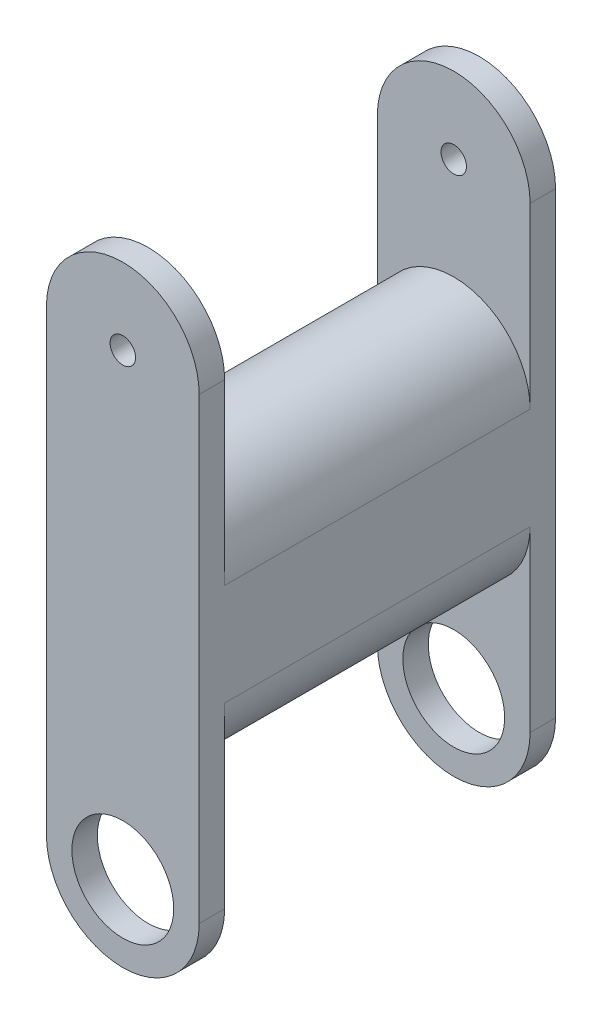
ISO-10303-21;
HEADER;
FILE_DESCRIPTION(('STEP AP214'),'2;1');
FILE_NAME('part.step','',(''),(''),'','','');
FILE_SCHEMA(('AUTOMOTIVE_DESIGN { 1 0 10303 214 1 1 1 1 }'));
ENDSEC;
DATA;
#1=APPLICATION_CONTEXT('core data for automotive mechanical design processes');
#2=APPLICATION_PROTOCOL_DEFINITION('international standard','automotive_design',2000,#1);
#3=PRODUCT_CONTEXT('',#1,'mechanical');
#4=PRODUCT('Part','Part','',(#3));
#5=PRODUCT_RELATED_PRODUCT_CATEGORY('part','',(#4));
#6=PRODUCT_DEFINITION_FORMATION('','',#4);
#7=PRODUCT_DEFINITION_CONTEXT('part definition',#1,'design');
#8=PRODUCT_DEFINITION('design','',#6,#7);
#9=PRODUCT_DEFINITION_SHAPE('','',#8);
#10=(LENGTH_UNIT() NAMED_UNIT(*) SI_UNIT(.MILLI.,.METRE.));
#11=(NAMED_UNIT(*) PLANE_ANGLE_UNIT() SI_UNIT($,.RADIAN.));
#12=(NAMED_UNIT(*) SI_UNIT($,.STERADIAN.) SOLID_ANGLE_UNIT());
#13=UNCERTAINTY_MEASURE_WITH_UNIT(LENGTH_MEASURE(1.E-05),#10,'distance_accuracy_value','');
#14=(GEOMETRIC_REPRESENTATION_CONTEXT(3) GLOBAL_UNCERTAINTY_ASSIGNED_CONTEXT((#13)) GLOBAL_UNIT_ASSIGNED_CONTEXT((#10,
#11,#12)) REPRESENTATION_CONTEXT('',''));
#15=CARTESIAN_POINT('',(0.,0.,0.));
#16=DIRECTION('',(0.,0.,1.));
#17=DIRECTION('',(1.,0.,0.));
#18=AXIS2_PLACEMENT_3D('',#15,#16,#17);
#19=CARTESIAN_POINT('',(15.,90.,70.));
#20=DIRECTION('',(-1.,0.,0.));
#21=DIRECTION('',(0.,-1.,0.));
#22=AXIS2_PLACEMENT_3D('',#19,#20,#21);
#23=PLANE('',#22);
#24=DIRECTION('',(0.,0.,1.));
#25=VECTOR('',#24,1.);
#26=CARTESIAN_POINT('',(15.,55.,-16.2132034355964));
#27=LINE('',#26,#25);
#28=CARTESIAN_POINT('',(15.,55.,5.00000000000001));
#29=VERTEX_POINT('',#28);
#30=CARTESIAN_POINT('',(15.,55.,65.));
#31=VERTEX_POINT('',#30);
#32=EDGE_CURVE('E190',#29,#31,#27,.T.);
#33=ORIENTED_EDGE('',*,*,#32,.T.);
#34=DIRECTION('',(0.,-1.,0.));
#35=VECTOR('',#34,1.);
#36=CARTESIAN_POINT('',(15.,90.,65.));
#37=LINE('',#36,#35);
#38=CARTESIAN_POINT('',(15.,90.,65.));
#39=VERTEX_POINT('',#38);
#40=EDGE_CURVE('E175',#39,#31,#37,.T.);
#41=ORIENTED_EDGE('',*,*,#40,.F.);
#42=DIRECTION('',(0.,0.,-1.));
#43=VECTOR('',#42,1.);
#44=CARTESIAN_POINT('',(15.,90.,70.));
#45=LINE('',#44,#43);
#46=CARTESIAN_POINT('',(15.,90.,70.));
#47=VERTEX_POINT('',#46);
#48=EDGE_CURVE('E264',#47,#39,#45,.T.);
#49=ORIENTED_EDGE('',*,*,#48,.F.);
#50=DIRECTION('',(0.,1.,0.));
#51=VECTOR('',#50,1.);
#52=CARTESIAN_POINT('',(15.,90.,70.));
#53=LINE('',#52,#51);
#54=CARTESIAN_POINT('',(15.,0.,70.));
#55=VERTEX_POINT('',#54);
#56=EDGE_CURVE('E92',#55,#47,#53,.T.);
#57=ORIENTED_EDGE('',*,*,#56,.F.);
#58=DIRECTION('',(0.,0.,-1.));
#59=VECTOR('',#58,1.);
#60=CARTESIAN_POINT('',(15.,0.,70.));
#61=LINE('',#60,#59);
#62=CARTESIAN_POINT('',(15.,0.,65.));
#63=VERTEX_POINT('',#62);
#64=EDGE_CURVE('E266',#55,#63,#61,.T.);
#65=ORIENTED_EDGE('',*,*,#64,.T.);
#66=DIRECTION('',(0.,-1.,0.));
#67=VECTOR('',#66,1.);
#68=CARTESIAN_POINT('',(15.,90.,65.));
#69=LINE('',#68,#67);
#70=CARTESIAN_POINT('',(15.,35.,65.));
#71=VERTEX_POINT('',#70);
#72=EDGE_CURVE('E228',#71,#63,#69,.T.);
#73=ORIENTED_EDGE('',*,*,#72,.F.);
#74=DIRECTION('',(0.,0.,1.));
#75=VECTOR('',#74,1.);
#76=CARTESIAN_POINT('',(15.,35.,-16.2132034355964));
#77=LINE('',#76,#75);
#78=CARTESIAN_POINT('',(15.,35.,5.00000000000001));
#79=VERTEX_POINT('',#78);
#80=EDGE_CURVE('E198',#79,#71,#77,.T.);
#81=ORIENTED_EDGE('',*,*,#80,.F.);
#82=DIRECTION('',(0.,-1.,0.));
#83=VECTOR('',#82,1.);
#84=CARTESIAN_POINT('',(15.,90.,5.00000000000005));
#85=LINE('',#84,#83);
#86=CARTESIAN_POINT('',(15.,0.,5.00000000000003));
#87=VERTEX_POINT('',#86);
#88=EDGE_CURVE('E232',#79,#87,#85,.T.);
#89=ORIENTED_EDGE('',*,*,#88,.T.);
#90=CARTESIAN_POINT('',(15.,0.,0.));
#91=VERTEX_POINT('',#90);
#92=EDGE_CURVE('E110',#87,#91,#61,.T.);
#93=ORIENTED_EDGE('',*,*,#92,.T.);
#94=DIRECTION('',(0.,1.,0.));
#95=VECTOR('',#94,1.);
#96=CARTESIAN_POINT('',(15.,90.,0.));
#97=LINE('',#96,#95);
#98=CARTESIAN_POINT('',(15.,90.,0.));
#99=VERTEX_POINT('',#98);
#100=EDGE_CURVE('E252',#91,#99,#97,.T.);
#101=ORIENTED_EDGE('',*,*,#100,.T.);
#102=CARTESIAN_POINT('',(15.,90.,5.));
#103=VERTEX_POINT('',#102);
#104=EDGE_CURVE('E118',#103,#99,#45,.T.);
#105=ORIENTED_EDGE('',*,*,#104,.F.);
#106=DIRECTION('',(0.,-1.,0.));
#107=VECTOR('',#106,1.);
#108=CARTESIAN_POINT('',(15.,90.,5.));
#109=LINE('',#108,#107);
#110=EDGE_CURVE('E195',#103,#29,#109,.T.);
#111=ORIENTED_EDGE('',*,*,#110,.T.);
#112=EDGE_LOOP('',(#33,#41,#49,#57,#65,#73,#81,#89,#93,#101,#105,#111));
#113=FACE_BOUND('',#112,.T.);
#114=ADVANCED_FACE('F73',(#113),#23,.F.);
#115=CARTESIAN_POINT('',(0.,90.,70.));
#116=DIRECTION('',(0.,0.,-1.));
#117=DIRECTION('',(-1.,0.,0.));
#118=AXIS2_PLACEMENT_3D('',#115,#116,#117);
#119=CYLINDRICAL_SURFACE('',#118,15.);
#120=CARTESIAN_POINT('',(0.,90.,65.));
#121=DIRECTION('',(0.,0.,-1.));
#122=DIRECTION('',(-1.,0.,0.));
#123=AXIS2_PLACEMENT_3D('',#120,#121,#122);
#124=CIRCLE('',#123,15.);
#125=CARTESIAN_POINT('',(-15.,90.,65.));
#126=VERTEX_POINT('',#125);
#127=EDGE_CURVE('E180',#126,#39,#124,.T.);
#128=ORIENTED_EDGE('',*,*,#127,.F.);
#129=DIRECTION('',(0.,0.,-1.));
#130=VECTOR('',#129,1.);
#131=CARTESIAN_POINT('',(-15.,90.,70.));
#132=LINE('',#131,#130);
#133=CARTESIAN_POINT('',(-15.,90.,70.));
#134=VERTEX_POINT('',#133);
#135=EDGE_CURVE('E12',#134,#126,#132,.T.);
#136=ORIENTED_EDGE('',*,*,#135,.F.);
#137=CARTESIAN_POINT('',(0.,90.,70.));
#138=DIRECTION('',(0.,0.,1.));
#139=DIRECTION('',(1.,0.,0.));
#140=AXIS2_PLACEMENT_3D('',#137,#138,#139);
#141=CIRCLE('',#140,15.);
#142=EDGE_CURVE('E250',#47,#134,#141,.T.);
#143=ORIENTED_EDGE('',*,*,#142,.F.);
#144=ORIENTED_EDGE('',*,*,#48,.T.);
#145=EDGE_LOOP('',(#128,#136,#143,#144));
#146=FACE_BOUND('',#145,.T.);
#147=ADVANCED_FACE('F300',(#146),#119,.T.);
#148=CARTESIAN_POINT('',(-15.,90.,70.));
#149=DIRECTION('',(1.,0.,0.));
#150=DIRECTION('',(0.,1.,0.));
#151=AXIS2_PLACEMENT_3D('',#148,#149,#150);
#152=PLANE('',#151);
#153=DIRECTION('',(0.,0.,1.));
#154=VECTOR('',#153,1.);
#155=CARTESIAN_POINT('',(-15.,55.,-16.2132034355964));
#156=LINE('',#155,#154);
#157=CARTESIAN_POINT('',(-15.,55.,5.00000000000001));
#158=VERTEX_POINT('',#157);
#159=CARTESIAN_POINT('',(-15.,55.,65.));
#160=VERTEX_POINT('',#159);
#161=EDGE_CURVE('E192',#158,#160,#156,.T.);
#162=ORIENTED_EDGE('',*,*,#161,.F.);
#163=DIRECTION('',(0.,-1.,0.));
#164=VECTOR('',#163,1.);
#165=CARTESIAN_POINT('',(-15.,120.,5.));
#166=LINE('',#165,#164);
#167=CARTESIAN_POINT('',(-15.,90.,5.00000000000001));
#168=VERTEX_POINT('',#167);
#169=EDGE_CURVE('E216',#168,#158,#166,.T.);
#170=ORIENTED_EDGE('',*,*,#169,.F.);
#171=CARTESIAN_POINT('',(-15.,90.,0.));
#172=VERTEX_POINT('',#171);
#173=EDGE_CURVE('E83',#168,#172,#132,.T.);
#174=ORIENTED_EDGE('',*,*,#173,.T.);
#175=DIRECTION('',(0.,-1.,0.));
#176=VECTOR('',#175,1.);
#177=CARTESIAN_POINT('',(-15.,90.,0.));
#178=LINE('',#177,#176);
#179=CARTESIAN_POINT('',(-15.,0.,0.));
#180=VERTEX_POINT('',#179);
#181=EDGE_CURVE('E258',#172,#180,#178,.T.);
#182=ORIENTED_EDGE('',*,*,#181,.T.);
#183=DIRECTION('',(0.,0.,-1.));
#184=VECTOR('',#183,1.);
#185=CARTESIAN_POINT('',(-15.,0.,70.));
#186=LINE('',#185,#184);
#187=CARTESIAN_POINT('',(-15.,0.,5.00000000000002));
#188=VERTEX_POINT('',#187);
#189=EDGE_CURVE('E269',#188,#180,#186,.T.);
#190=ORIENTED_EDGE('',*,*,#189,.F.);
#191=DIRECTION('',(0.,-1.,0.));
#192=VECTOR('',#191,1.);
#193=CARTESIAN_POINT('',(-15.,20.,5.00000000000003));
#194=LINE('',#193,#192);
#195=CARTESIAN_POINT('',(-15.,35.,5.00000000000001));
#196=VERTEX_POINT('',#195);
#197=EDGE_CURVE('E217',#196,#188,#194,.T.);
#198=ORIENTED_EDGE('',*,*,#197,.F.);
#199=DIRECTION('',(0.,0.,1.));
#200=VECTOR('',#199,1.);
#201=CARTESIAN_POINT('',(-15.,35.,-16.2132034355964));
#202=LINE('',#201,#200);
#203=CARTESIAN_POINT('',(-15.,35.,65.));
#204=VERTEX_POINT('',#203);
#205=EDGE_CURVE('E193',#196,#204,#202,.T.);
#206=ORIENTED_EDGE('',*,*,#205,.T.);
#207=DIRECTION('',(0.,-1.,0.));
#208=VECTOR('',#207,1.);
#209=CARTESIAN_POINT('',(-15.,20.,65.));
#210=LINE('',#209,#208);
#211=CARTESIAN_POINT('',(-15.,0.,65.));
#212=VERTEX_POINT('',#211);
#213=EDGE_CURVE('E208',#204,#212,#210,.T.);
#214=ORIENTED_EDGE('',*,*,#213,.T.);
#215=CARTESIAN_POINT('',(-15.,0.,70.));
#216=VERTEX_POINT('',#215);
#217=EDGE_CURVE('E270',#216,#212,#186,.T.);
#218=ORIENTED_EDGE('',*,*,#217,.F.);
#219=DIRECTION('',(0.,-1.,0.));
#220=VECTOR('',#219,1.);
#221=CARTESIAN_POINT('',(-15.,90.,70.));
#222=LINE('',#221,#220);
#223=EDGE_CURVE('E124',#134,#216,#222,.T.);
#224=ORIENTED_EDGE('',*,*,#223,.F.);
#225=ORIENTED_EDGE('',*,*,#135,.T.);
#226=DIRECTION('',(0.,-1.,0.));
#227=VECTOR('',#226,1.);
#228=CARTESIAN_POINT('',(-15.,120.,65.));
#229=LINE('',#228,#227);
#230=EDGE_CURVE('E214',#126,#160,#229,.T.);
#231=ORIENTED_EDGE('',*,*,#230,.T.);
#232=EDGE_LOOP('',(#162,#170,#174,#182,#190,#198,#206,#214,#218,#224,#225,#231));
#233=FACE_BOUND('',#232,.T.);
#234=ADVANCED_FACE('F291',(#233),#152,.F.);
#235=CARTESIAN_POINT('',(0.,0.,70.));
#236=DIRECTION('',(0.,0.,-1.));
#237=DIRECTION('',(-1.,0.,0.));
#238=AXIS2_PLACEMENT_3D('',#235,#236,#237);
#239=CYLINDRICAL_SURFACE('',#238,15.);
#240=CARTESIAN_POINT('',(0.,0.,65.));
#241=DIRECTION('',(0.,0.,-1.));
#242=DIRECTION('',(-1.,0.,0.));
#243=AXIS2_PLACEMENT_3D('',#240,#241,#242);
#244=CIRCLE('',#243,15.);
#245=EDGE_CURVE('E230',#63,#212,#244,.T.);
#246=ORIENTED_EDGE('',*,*,#245,.F.);
#247=ORIENTED_EDGE('',*,*,#64,.F.);
#248=CARTESIAN_POINT('',(0.,0.,70.));
#249=DIRECTION('',(0.,0.,1.));
#250=DIRECTION('',(1.,0.,0.));
#251=AXIS2_PLACEMENT_3D('',#248,#249,#250);
#252=CIRCLE('',#251,15.);
#253=EDGE_CURVE('E254',#216,#55,#252,.T.);
#254=ORIENTED_EDGE('',*,*,#253,.F.);
#255=ORIENTED_EDGE('',*,*,#217,.T.);
#256=EDGE_LOOP('',(#246,#247,#254,#255));
#257=FACE_BOUND('',#256,.T.);
#258=ADVANCED_FACE('F294',(#257),#239,.T.);
#259=CARTESIAN_POINT('',(0.,0.,70.));
#260=DIRECTION('',(0.,0.,-1.));
#261=DIRECTION('',(-1.,0.,0.));
#262=AXIS2_PLACEMENT_3D('',#259,#260,#261);
#263=CYLINDRICAL_SURFACE('',#262,10.);
#264=CARTESIAN_POINT('',(0.,0.,70.));
#265=DIRECTION('',(0.,0.,1.));
#266=DIRECTION('',(1.,0.,0.));
#267=AXIS2_PLACEMENT_3D('',#264,#265,#266);
#268=CIRCLE('',#267,10.);
#269=CARTESIAN_POINT('',(10.,0.,70.));
#270=VERTEX_POINT('',#269);
#271=EDGE_CURVE('E244',#270,#270,#268,.T.);
#272=ORIENTED_EDGE('',*,*,#271,.T.);
#273=EDGE_LOOP('',(#272));
#274=FACE_BOUND('',#273,.T.);
#275=CARTESIAN_POINT('',(0.,0.,65.));
#276=DIRECTION('',(0.,0.,-1.));
#277=DIRECTION('',(-1.,0.,0.));
#278=AXIS2_PLACEMENT_3D('',#275,#276,#277);
#279=CIRCLE('',#278,10.);
#280=CARTESIAN_POINT('',(-10.,0.,65.));
#281=VERTEX_POINT('',#280);
#282=EDGE_CURVE('E227',#281,#281,#279,.T.);
#283=ORIENTED_EDGE('',*,*,#282,.T.);
#284=EDGE_LOOP('',(#283));
#285=FACE_BOUND('',#284,.T.);
#286=ADVANCED_FACE('F279',(#274,#285),#263,.F.);
#287=CARTESIAN_POINT('',(0.,90.,70.));
#288=DIRECTION('',(0.,0.,-1.));
#289=DIRECTION('',(-1.,0.,0.));
#290=AXIS2_PLACEMENT_3D('',#287,#288,#289);
#291=CYLINDRICAL_SURFACE('',#290,2.5);
#292=CARTESIAN_POINT('',(0.,90.,70.));
#293=DIRECTION('',(0.,0.,1.));
#294=DIRECTION('',(1.,0.,0.));
#295=AXIS2_PLACEMENT_3D('',#292,#293,#294);
#296=CIRCLE('',#295,2.5);
#297=CARTESIAN_POINT('',(2.5,90.,70.));
#298=VERTEX_POINT('',#297);
#299=EDGE_CURVE('E238',#298,#298,#296,.T.);
#300=ORIENTED_EDGE('',*,*,#299,.T.);
#301=EDGE_LOOP('',(#300));
#302=FACE_BOUND('',#301,.T.);
#303=CARTESIAN_POINT('',(0.,90.,65.));
#304=DIRECTION('',(0.,0.,-1.));
#305=DIRECTION('',(-1.,0.,0.));
#306=AXIS2_PLACEMENT_3D('',#303,#304,#305);
#307=CIRCLE('',#306,2.5);
#308=CARTESIAN_POINT('',(-2.5,90.,65.));
#309=VERTEX_POINT('',#308);
#310=EDGE_CURVE('E183',#309,#309,#307,.T.);
#311=ORIENTED_EDGE('',*,*,#310,.T.);
#312=EDGE_LOOP('',(#311));
#313=FACE_BOUND('',#312,.T.);
#314=ADVANCED_FACE('F342',(#302,#313),#291,.F.);
#315=CARTESIAN_POINT('',(0.,90.,70.));
#316=DIRECTION('',(0.,0.,1.));
#317=DIRECTION('',(1.,0.,0.));
#318=AXIS2_PLACEMENT_3D('',#315,#316,#317);
#319=PLANE('',#318);
#320=ORIENTED_EDGE('',*,*,#271,.F.);
#321=EDGE_LOOP('',(#320));
#322=FACE_BOUND('',#321,.T.);
#323=ORIENTED_EDGE('',*,*,#142,.T.);
#324=ORIENTED_EDGE('',*,*,#223,.T.);
#325=ORIENTED_EDGE('',*,*,#253,.T.);
#326=ORIENTED_EDGE('',*,*,#56,.T.);
#327=EDGE_LOOP('',(#323,#324,#325,#326));
#328=FACE_BOUND('',#327,.T.);
#329=ORIENTED_EDGE('',*,*,#299,.F.);
#330=EDGE_LOOP('',(#329));
#331=FACE_BOUND('',#330,.T.);
#332=ADVANCED_FACE('F295',(#322,#328,#331),#319,.T.);
#333=CARTESIAN_POINT('',(0.,90.,0.));
#334=DIRECTION('',(0.,0.,1.));
#335=DIRECTION('',(1.,0.,0.));
#336=AXIS2_PLACEMENT_3D('',#333,#334,#335);
#337=PLANE('',#336);
#338=CARTESIAN_POINT('',(0.,90.,0.));
#339=DIRECTION('',(0.,0.,1.));
#340=DIRECTION('',(1.,0.,0.));
#341=AXIS2_PLACEMENT_3D('',#338,#339,#340);
#342=CIRCLE('',#341,15.);
#343=EDGE_CURVE('E247',#99,#172,#342,.T.);
#344=ORIENTED_EDGE('',*,*,#343,.F.);
#345=ORIENTED_EDGE('',*,*,#100,.F.);
#346=CARTESIAN_POINT('',(0.,0.,0.));
#347=DIRECTION('',(0.,0.,1.));
#348=DIRECTION('',(1.,0.,0.));
#349=AXIS2_PLACEMENT_3D('',#346,#347,#348);
#350=CIRCLE('',#349,15.);
#351=EDGE_CURVE('E261',#180,#91,#350,.T.);
#352=ORIENTED_EDGE('',*,*,#351,.F.);
#353=ORIENTED_EDGE('',*,*,#181,.F.);
#354=EDGE_LOOP('',(#344,#345,#352,#353));
#355=FACE_BOUND('',#354,.T.);
#356=CARTESIAN_POINT('',(0.,0.,0.));
#357=DIRECTION('',(0.,0.,1.));
#358=DIRECTION('',(1.,0.,0.));
#359=AXIS2_PLACEMENT_3D('',#356,#357,#358);
#360=CIRCLE('',#359,10.);
#361=CARTESIAN_POINT('',(10.,0.,0.));
#362=VERTEX_POINT('',#361);
#363=EDGE_CURVE('E241',#362,#362,#360,.T.);
#364=ORIENTED_EDGE('',*,*,#363,.T.);
#365=EDGE_LOOP('',(#364));
#366=FACE_BOUND('',#365,.T.);
#367=CARTESIAN_POINT('',(0.,90.,0.));
#368=DIRECTION('',(0.,0.,1.));
#369=DIRECTION('',(1.,0.,0.));
#370=AXIS2_PLACEMENT_3D('',#367,#368,#369);
#371=CIRCLE('',#370,2.5);
#372=CARTESIAN_POINT('',(2.5,90.,0.));
#373=VERTEX_POINT('',#372);
#374=EDGE_CURVE('E237',#373,#373,#371,.T.);
#375=ORIENTED_EDGE('',*,*,#374,.T.);
#376=EDGE_LOOP('',(#375));
#377=FACE_BOUND('',#376,.T.);
#378=ADVANCED_FACE('F308',(#355,#366,#377),#337,.F.);
#379=ORIENTED_EDGE('',*,*,#173,.F.);
#380=CARTESIAN_POINT('',(0.,90.,5.));
#381=DIRECTION('',(0.,0.,-1.));
#382=DIRECTION('',(0.,1.,0.));
#383=AXIS2_PLACEMENT_3D('',#380,#381,#382);
#384=CIRCLE('',#383,15.);
#385=EDGE_CURVE('E224',#168,#103,#384,.T.);
#386=ORIENTED_EDGE('',*,*,#385,.T.);
#387=ORIENTED_EDGE('',*,*,#104,.T.);
#388=ORIENTED_EDGE('',*,*,#343,.T.);
#389=EDGE_LOOP('',(#379,#386,#387,#388));
#390=FACE_BOUND('',#389,.T.);
#391=ADVANCED_FACE('F75',(#390),#119,.T.);
#392=ORIENTED_EDGE('',*,*,#92,.F.);
#393=CARTESIAN_POINT('',(0.,0.,5.00000000000003));
#394=DIRECTION('',(0.,0.,-1.));
#395=DIRECTION('',(0.,1.,0.));
#396=AXIS2_PLACEMENT_3D('',#393,#394,#395);
#397=CIRCLE('',#396,15.);
#398=EDGE_CURVE('E234',#87,#188,#397,.T.);
#399=ORIENTED_EDGE('',*,*,#398,.T.);
#400=ORIENTED_EDGE('',*,*,#189,.T.);
#401=ORIENTED_EDGE('',*,*,#351,.T.);
#402=EDGE_LOOP('',(#392,#399,#400,#401));
#403=FACE_BOUND('',#402,.T.);
#404=ADVANCED_FACE('F313',(#403),#239,.T.);
#405=CARTESIAN_POINT('',(0.,0.,5.00000000000003));
#406=DIRECTION('',(0.,0.,-1.));
#407=DIRECTION('',(0.,1.,0.));
#408=AXIS2_PLACEMENT_3D('',#405,#406,#407);
#409=CIRCLE('',#408,10.);
#410=CARTESIAN_POINT('',(0.,10.,5.00000000000003));
#411=VERTEX_POINT('',#410);
#412=EDGE_CURVE('E77',#411,#411,#409,.T.);
#413=ORIENTED_EDGE('',*,*,#412,.F.);
#414=EDGE_LOOP('',(#413));
#415=FACE_BOUND('',#414,.T.);
#416=ORIENTED_EDGE('',*,*,#363,.F.);
#417=EDGE_LOOP('',(#416));
#418=FACE_BOUND('',#417,.T.);
#419=ADVANCED_FACE('F334',(#415,#418),#263,.F.);
#420=CARTESIAN_POINT('',(0.,90.,5.));
#421=DIRECTION('',(0.,0.,-1.));
#422=DIRECTION('',(0.,1.,0.));
#423=AXIS2_PLACEMENT_3D('',#420,#421,#422);
#424=CIRCLE('',#423,2.5);
#425=CARTESIAN_POINT('',(0.,92.5,5.));
#426=VERTEX_POINT('',#425);
#427=EDGE_CURVE('E219',#426,#426,#424,.T.);
#428=ORIENTED_EDGE('',*,*,#427,.F.);
#429=EDGE_LOOP('',(#428));
#430=FACE_BOUND('',#429,.T.);
#431=ORIENTED_EDGE('',*,*,#374,.F.);
#432=EDGE_LOOP('',(#431));
#433=FACE_BOUND('',#432,.T.);
#434=ADVANCED_FACE('F350',(#430,#433),#291,.F.);
#435=CARTESIAN_POINT('',(55.,120.,65.));
#436=DIRECTION('',(0.,0.,-1.));
#437=DIRECTION('',(-1.,0.,0.));
#438=AXIS2_PLACEMENT_3D('',#435,#436,#437);
#439=PLANE('',#438);
#440=ORIENTED_EDGE('',*,*,#310,.F.);
#441=EDGE_LOOP('',(#440));
#442=FACE_BOUND('',#441,.T.);
#443=ORIENTED_EDGE('',*,*,#127,.T.);
#444=ORIENTED_EDGE('',*,*,#40,.T.);
#445=CARTESIAN_POINT('',(0.,55.,65.));
#446=DIRECTION('',(0.,0.,-1.));
#447=DIRECTION('',(-1.,0.,0.));
#448=AXIS2_PLACEMENT_3D('',#445,#446,#447);
#449=CIRCLE('',#448,15.);
#450=EDGE_CURVE('E178',#160,#31,#449,.T.);
#451=ORIENTED_EDGE('',*,*,#450,.F.);
#452=ORIENTED_EDGE('',*,*,#230,.F.);
#453=EDGE_LOOP('',(#443,#444,#451,#452));
#454=FACE_BOUND('',#453,.T.);
#455=ADVANCED_FACE('F177',(#442,#454),#439,.T.);
#456=CARTESIAN_POINT('',(55.,120.,5.));
#457=DIRECTION('',(0.,0.,-1.));
#458=DIRECTION('',(0.,1.,0.));
#459=AXIS2_PLACEMENT_3D('',#456,#457,#458);
#460=PLANE('',#459);
#461=ORIENTED_EDGE('',*,*,#427,.T.);
#462=EDGE_LOOP('',(#461));
#463=FACE_BOUND('',#462,.T.);
#464=ORIENTED_EDGE('',*,*,#169,.T.);
#465=CARTESIAN_POINT('',(0.,55.,5.00000000000001));
#466=DIRECTION('',(0.,0.,-1.));
#467=DIRECTION('',(0.,1.,0.));
#468=AXIS2_PLACEMENT_3D('',#465,#466,#467);
#469=CIRCLE('',#468,15.);
#470=EDGE_CURVE('E206',#158,#29,#469,.T.);
#471=ORIENTED_EDGE('',*,*,#470,.T.);
#472=ORIENTED_EDGE('',*,*,#110,.F.);
#473=ORIENTED_EDGE('',*,*,#385,.F.);
#474=EDGE_LOOP('',(#464,#471,#472,#473));
#475=FACE_BOUND('',#474,.T.);
#476=ADVANCED_FACE('F422',(#463,#475),#460,.F.);
#477=CARTESIAN_POINT('',(55.,20.,5.00000000000003));
#478=DIRECTION('',(0.,0.,-1.));
#479=DIRECTION('',(0.,1.,0.));
#480=AXIS2_PLACEMENT_3D('',#477,#478,#479);
#481=PLANE('',#480);
#482=ORIENTED_EDGE('',*,*,#412,.T.);
#483=EDGE_LOOP('',(#482));
#484=FACE_BOUND('',#483,.T.);
#485=ORIENTED_EDGE('',*,*,#88,.F.);
#486=CARTESIAN_POINT('',(0.,35.,5.00000000000001));
#487=DIRECTION('',(0.,0.,-1.));
#488=DIRECTION('',(0.,1.,0.));
#489=AXIS2_PLACEMENT_3D('',#486,#487,#488);
#490=CIRCLE('',#489,15.);
#491=EDGE_CURVE('E201',#79,#196,#490,.T.);
#492=ORIENTED_EDGE('',*,*,#491,.T.);
#493=ORIENTED_EDGE('',*,*,#197,.T.);
#494=ORIENTED_EDGE('',*,*,#398,.F.);
#495=EDGE_LOOP('',(#485,#492,#493,#494));
#496=FACE_BOUND('',#495,.T.);
#497=ADVANCED_FACE('F285',(#484,#496),#481,.F.);
#498=CARTESIAN_POINT('',(55.,20.,65.));
#499=DIRECTION('',(0.,0.,-1.));
#500=DIRECTION('',(-1.,0.,0.));
#501=AXIS2_PLACEMENT_3D('',#498,#499,#500);
#502=PLANE('',#501);
#503=ORIENTED_EDGE('',*,*,#282,.F.);
#504=EDGE_LOOP('',(#503));
#505=FACE_BOUND('',#504,.T.);
#506=ORIENTED_EDGE('',*,*,#245,.T.);
#507=ORIENTED_EDGE('',*,*,#213,.F.);
#508=CARTESIAN_POINT('',(0.,35.,65.));
#509=DIRECTION('',(0.,0.,-1.));
#510=DIRECTION('',(-1.,0.,0.));
#511=AXIS2_PLACEMENT_3D('',#508,#509,#510);
#512=CIRCLE('',#511,15.);
#513=EDGE_CURVE('E197',#71,#204,#512,.T.);
#514=ORIENTED_EDGE('',*,*,#513,.F.);
#515=ORIENTED_EDGE('',*,*,#72,.T.);
#516=EDGE_LOOP('',(#506,#507,#514,#515));
#517=FACE_BOUND('',#516,.T.);
#518=ADVANCED_FACE('F281',(#505,#517),#502,.T.);
#519=CARTESIAN_POINT('',(0.,35.,-16.2132034355964));
#520=DIRECTION('',(0.,0.,1.));
#521=DIRECTION('',(0.,-1.,0.));
#522=AXIS2_PLACEMENT_3D('',#519,#520,#521);
#523=CYLINDRICAL_SURFACE('',#522,15.);
#524=ORIENTED_EDGE('',*,*,#491,.F.);
#525=ORIENTED_EDGE('',*,*,#80,.T.);
#526=ORIENTED_EDGE('',*,*,#513,.T.);
#527=ORIENTED_EDGE('',*,*,#205,.F.);
#528=EDGE_LOOP('',(#524,#525,#526,#527));
#529=FACE_BOUND('',#528,.T.);
#530=ADVANCED_FACE('F284',(#529),#523,.T.);
#531=CARTESIAN_POINT('',(0.,55.,-16.2132034355964));
#532=DIRECTION('',(0.,0.,1.));
#533=DIRECTION('',(0.,-1.,0.));
#534=AXIS2_PLACEMENT_3D('',#531,#532,#533);
#535=CYLINDRICAL_SURFACE('',#534,15.);
#536=ORIENTED_EDGE('',*,*,#161,.T.);
#537=ORIENTED_EDGE('',*,*,#450,.T.);
#538=ORIENTED_EDGE('',*,*,#32,.F.);
#539=ORIENTED_EDGE('',*,*,#470,.F.);
#540=EDGE_LOOP('',(#536,#537,#538,#539));
#541=FACE_BOUND('',#540,.T.);
#542=ADVANCED_FACE('F188',(#541),#535,.T.);
#543=CLOSED_SHELL('',(#114,#147,#234,#258,#286,#314,#332,#378,#391,#404,#419,#434,#455,#476,
#497,#518,#530,#542));
#544=MANIFOLD_SOLID_BREP('B2',#543);
#545=ADVANCED_BREP_SHAPE_REPRESENTATION('',(#18,#544),#14);
#546=SHAPE_DEFINITION_REPRESENTATION(#9,#545);
ENDSEC;
END-ISO-10303-21;
